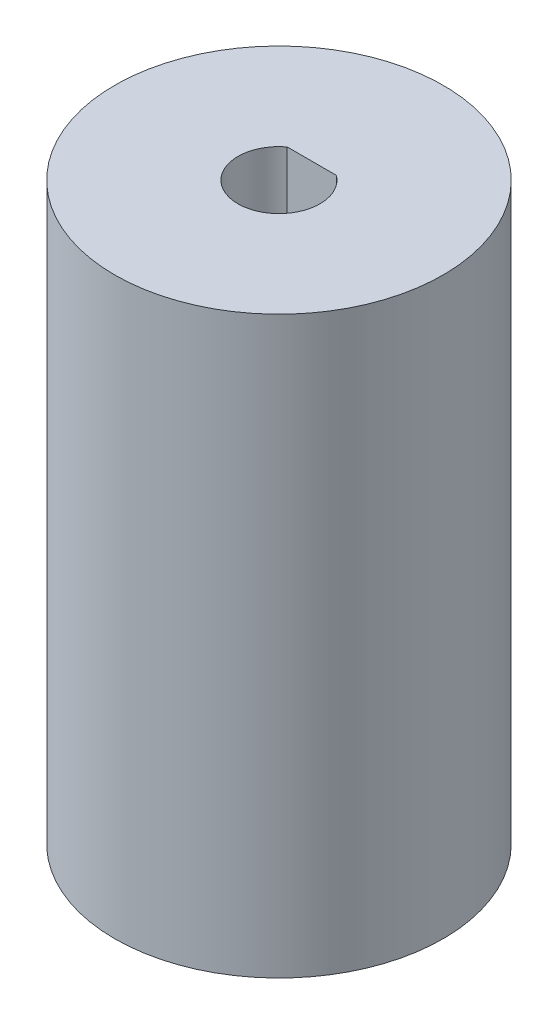
ISO-10303-21;
HEADER;
FILE_DESCRIPTION(('STEP AP214'),'2;1');
FILE_NAME('part.step','',(''),(''),'','','');
FILE_SCHEMA(('AUTOMOTIVE_DESIGN { 1 0 10303 214 1 1 1 1 }'));
ENDSEC;
DATA;
#1=APPLICATION_CONTEXT('core data for automotive mechanical design processes');
#2=APPLICATION_PROTOCOL_DEFINITION('international standard','automotive_design',2000,#1);
#3=PRODUCT_CONTEXT('',#1,'mechanical');
#4=PRODUCT('Part','Part','',(#3));
#5=PRODUCT_RELATED_PRODUCT_CATEGORY('part','',(#4));
#6=PRODUCT_DEFINITION_FORMATION('','',#4);
#7=PRODUCT_DEFINITION_CONTEXT('part definition',#1,'design');
#8=PRODUCT_DEFINITION('design','',#6,#7);
#9=PRODUCT_DEFINITION_SHAPE('','',#8);
#10=(LENGTH_UNIT() NAMED_UNIT(*) SI_UNIT(.MILLI.,.METRE.));
#11=(NAMED_UNIT(*) PLANE_ANGLE_UNIT() SI_UNIT($,.RADIAN.));
#12=(NAMED_UNIT(*) SI_UNIT($,.STERADIAN.) SOLID_ANGLE_UNIT());
#13=UNCERTAINTY_MEASURE_WITH_UNIT(LENGTH_MEASURE(1.E-05),#10,'distance_accuracy_value','');
#14=(GEOMETRIC_REPRESENTATION_CONTEXT(3) GLOBAL_UNCERTAINTY_ASSIGNED_CONTEXT((#13)) GLOBAL_UNIT_ASSIGNED_CONTEXT((#10,
#11,#12)) REPRESENTATION_CONTEXT('',''));
#15=CARTESIAN_POINT('',(0.,0.,0.));
#16=DIRECTION('',(0.,0.,1.));
#17=DIRECTION('',(1.,0.,0.));
#18=AXIS2_PLACEMENT_3D('',#15,#16,#17);
#19=CARTESIAN_POINT('',(0.,35.,0.));
#20=DIRECTION('',(0.,1.,0.));
#21=DIRECTION('',(0.,0.,1.));
#22=AXIS2_PLACEMENT_3D('',#19,#20,#21);
#23=PLANE('',#22);
#24=CARTESIAN_POINT('',(0.,35.,0.));
#25=DIRECTION('',(0.,1.,0.));
#26=DIRECTION('',(0.,0.,1.));
#27=AXIS2_PLACEMENT_3D('',#24,#25,#26);
#28=CIRCLE('',#27,10.);
#29=CARTESIAN_POINT('',(0.,35.,10.));
#30=VERTEX_POINT('',#29);
#31=EDGE_CURVE('E11',#30,#30,#28,.T.);
#32=ORIENTED_EDGE('',*,*,#31,.T.);
#33=EDGE_LOOP('',(#32));
#34=FACE_BOUND('',#33,.T.);
#35=CARTESIAN_POINT('',(0.,35.,0.));
#36=DIRECTION('',(0.,1.,0.));
#37=DIRECTION('',(0.,0.,1.));
#38=AXIS2_PLACEMENT_3D('',#35,#36,#37);
#39=CIRCLE('',#38,2.5);
#40=CARTESIAN_POINT('',(-1.5,35.,-2.));
#41=VERTEX_POINT('',#40);
#42=CARTESIAN_POINT('',(1.5,35.,-2.));
#43=VERTEX_POINT('',#42);
#44=EDGE_CURVE('E74',#41,#43,#39,.T.);
#45=ORIENTED_EDGE('',*,*,#44,.F.);
#46=DIRECTION('',(1.,0.,0.));
#47=VECTOR('',#46,1.);
#48=CARTESIAN_POINT('',(0.,35.,-2.));
#49=LINE('',#48,#47);
#50=EDGE_CURVE('E54',#41,#43,#49,.T.);
#51=ORIENTED_EDGE('',*,*,#50,.T.);
#52=EDGE_LOOP('',(#45,#51));
#53=FACE_BOUND('',#52,.T.);
#54=ADVANCED_FACE('F39',(#34,#53),#23,.T.);
#55=CARTESIAN_POINT('',(0.,35.,0.));
#56=DIRECTION('',(0.,-1.,0.));
#57=DIRECTION('',(0.,0.,-1.));
#58=AXIS2_PLACEMENT_3D('',#55,#56,#57);
#59=CYLINDRICAL_SURFACE('',#58,10.);
#60=ORIENTED_EDGE('',*,*,#31,.F.);
#61=EDGE_LOOP('',(#60));
#62=FACE_BOUND('',#61,.T.);
#63=CARTESIAN_POINT('',(0.,0.,0.));
#64=DIRECTION('',(0.,1.,0.));
#65=DIRECTION('',(0.,0.,1.));
#66=AXIS2_PLACEMENT_3D('',#63,#64,#65);
#67=CIRCLE('',#66,10.);
#68=CARTESIAN_POINT('',(0.,0.,10.));
#69=VERTEX_POINT('',#68);
#70=EDGE_CURVE('E43',#69,#69,#67,.T.);
#71=ORIENTED_EDGE('',*,*,#70,.T.);
#72=EDGE_LOOP('',(#71));
#73=FACE_BOUND('',#72,.T.);
#74=ADVANCED_FACE('F41',(#62,#73),#59,.T.);
#75=CARTESIAN_POINT('',(0.,0.,0.));
#76=DIRECTION('',(0.,1.,0.));
#77=DIRECTION('',(0.,0.,1.));
#78=AXIS2_PLACEMENT_3D('',#75,#76,#77);
#79=PLANE('',#78);
#80=CARTESIAN_POINT('',(0.,0.,0.));
#81=DIRECTION('',(0.,-1.,0.));
#82=DIRECTION('',(0.,0.,-1.));
#83=AXIS2_PLACEMENT_3D('',#80,#81,#82);
#84=CIRCLE('',#83,4.);
#85=CARTESIAN_POINT('',(0.,0.,-4.));
#86=VERTEX_POINT('',#85);
#87=EDGE_CURVE('E70',#86,#86,#84,.T.);
#88=ORIENTED_EDGE('',*,*,#87,.F.);
#89=EDGE_LOOP('',(#88));
#90=FACE_BOUND('',#89,.T.);
#91=ORIENTED_EDGE('',*,*,#70,.F.);
#92=EDGE_LOOP('',(#91));
#93=FACE_BOUND('',#92,.T.);
#94=ADVANCED_FACE('F92',(#90,#93),#79,.F.);
#95=CARTESIAN_POINT('',(0.,15.,0.));
#96=DIRECTION('',(0.,-1.,0.));
#97=DIRECTION('',(0.,0.,-1.));
#98=AXIS2_PLACEMENT_3D('',#95,#96,#97);
#99=CYLINDRICAL_SURFACE('',#98,4.);
#100=CARTESIAN_POINT('',(0.,15.,0.));
#101=DIRECTION('',(0.,-1.,0.));
#102=DIRECTION('',(0.,0.,-1.));
#103=AXIS2_PLACEMENT_3D('',#100,#101,#102);
#104=CIRCLE('',#103,4.);
#105=CARTESIAN_POINT('',(0.,15.,-4.));
#106=VERTEX_POINT('',#105);
#107=EDGE_CURVE('E84',#106,#106,#104,.T.);
#108=ORIENTED_EDGE('',*,*,#107,.F.);
#109=EDGE_LOOP('',(#108));
#110=FACE_BOUND('',#109,.T.);
#111=ORIENTED_EDGE('',*,*,#87,.T.);
#112=EDGE_LOOP('',(#111));
#113=FACE_BOUND('',#112,.T.);
#114=ADVANCED_FACE('F90',(#110,#113),#99,.F.);
#115=CARTESIAN_POINT('',(0.,15.,0.));
#116=DIRECTION('',(0.,-1.,0.));
#117=DIRECTION('',(0.,0.,-1.));
#118=AXIS2_PLACEMENT_3D('',#115,#116,#117);
#119=PLANE('',#118);
#120=ORIENTED_EDGE('',*,*,#107,.T.);
#121=EDGE_LOOP('',(#120));
#122=FACE_BOUND('',#121,.T.);
#123=ADVANCED_FACE('F113',(#122),#119,.T.);
#124=CARTESIAN_POINT('',(0.,20.,-2.));
#125=DIRECTION('',(0.,0.,1.));
#126=DIRECTION('',(1.,0.,0.));
#127=AXIS2_PLACEMENT_3D('',#124,#125,#126);
#128=PLANE('',#127);
#129=ORIENTED_EDGE('',*,*,#50,.F.);
#130=DIRECTION('',(0.,1.,0.));
#131=VECTOR('',#130,1.);
#132=CARTESIAN_POINT('',(-1.5,20.,-2.));
#133=LINE('',#132,#131);
#134=CARTESIAN_POINT('',(-1.5,20.,-2.));
#135=VERTEX_POINT('',#134);
#136=EDGE_CURVE('E71',#135,#41,#133,.T.);
#137=ORIENTED_EDGE('',*,*,#136,.F.);
#138=DIRECTION('',(1.,0.,0.));
#139=VECTOR('',#138,1.);
#140=CARTESIAN_POINT('',(0.,20.,-2.));
#141=LINE('',#140,#139);
#142=CARTESIAN_POINT('',(1.5,20.,-2.));
#143=VERTEX_POINT('',#142);
#144=EDGE_CURVE('E60',#135,#143,#141,.T.);
#145=ORIENTED_EDGE('',*,*,#144,.T.);
#146=DIRECTION('',(0.,1.,0.));
#147=VECTOR('',#146,1.);
#148=CARTESIAN_POINT('',(1.5,20.,-2.));
#149=LINE('',#148,#147);
#150=EDGE_CURVE('E64',#143,#43,#149,.T.);
#151=ORIENTED_EDGE('',*,*,#150,.T.);
#152=EDGE_LOOP('',(#129,#137,#145,#151));
#153=FACE_BOUND('',#152,.T.);
#154=ADVANCED_FACE('F66',(#153),#128,.T.);
#155=CARTESIAN_POINT('',(0.,20.,0.));
#156=DIRECTION('',(0.,1.,0.));
#157=DIRECTION('',(0.,0.,1.));
#158=AXIS2_PLACEMENT_3D('',#155,#156,#157);
#159=CYLINDRICAL_SURFACE('',#158,2.5);
#160=ORIENTED_EDGE('',*,*,#44,.T.);
#161=ORIENTED_EDGE('',*,*,#150,.F.);
#162=CARTESIAN_POINT('',(0.,20.,0.));
#163=DIRECTION('',(0.,1.,0.));
#164=DIRECTION('',(0.,0.,1.));
#165=AXIS2_PLACEMENT_3D('',#162,#163,#164);
#166=CIRCLE('',#165,2.5);
#167=EDGE_CURVE('E80',#135,#143,#166,.T.);
#168=ORIENTED_EDGE('',*,*,#167,.F.);
#169=ORIENTED_EDGE('',*,*,#136,.T.);
#170=EDGE_LOOP('',(#160,#161,#168,#169));
#171=FACE_BOUND('',#170,.T.);
#172=ADVANCED_FACE('F75',(#171),#159,.F.);
#173=CARTESIAN_POINT('',(0.,20.,0.));
#174=DIRECTION('',(0.,1.,0.));
#175=DIRECTION('',(0.,0.,1.));
#176=AXIS2_PLACEMENT_3D('',#173,#174,#175);
#177=PLANE('',#176);
#178=ORIENTED_EDGE('',*,*,#144,.F.);
#179=ORIENTED_EDGE('',*,*,#167,.T.);
#180=EDGE_LOOP('',(#178,#179));
#181=FACE_BOUND('',#180,.T.);
#182=ADVANCED_FACE('F120',(#181),#177,.T.);
#183=CLOSED_SHELL('',(#54,#74,#94,#114,#123,#154,#172,#182));
#184=MANIFOLD_SOLID_BREP('B2',#183);
#185=ADVANCED_BREP_SHAPE_REPRESENTATION('',(#18,#184),#14);
#186=SHAPE_DEFINITION_REPRESENTATION(#9,#185);
ENDSEC;
END-ISO-10303-21;
